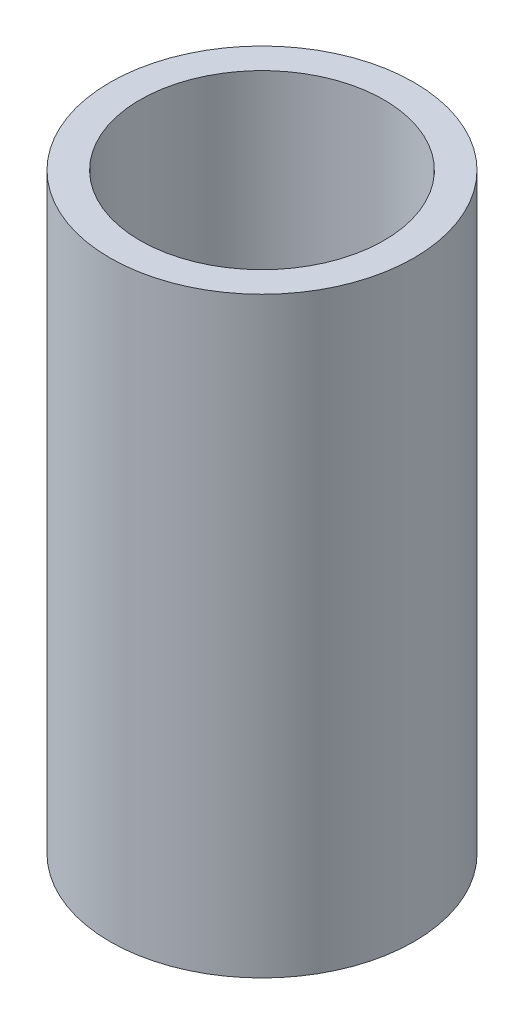
ISO-10303-21;
HEADER;
FILE_DESCRIPTION(('STEP AP214'),'2;1');
FILE_NAME('part.step','',(''),(''),'','','');
FILE_SCHEMA(('AUTOMOTIVE_DESIGN { 1 0 10303 214 1 1 1 1 }'));
ENDSEC;
DATA;
#1=APPLICATION_CONTEXT('core data for automotive mechanical design processes');
#2=APPLICATION_PROTOCOL_DEFINITION('international standard','automotive_design',2000,#1);
#3=PRODUCT_CONTEXT('',#1,'mechanical');
#4=PRODUCT('Part','Part','',(#3));
#5=PRODUCT_RELATED_PRODUCT_CATEGORY('part','',(#4));
#6=PRODUCT_DEFINITION_FORMATION('','',#4);
#7=PRODUCT_DEFINITION_CONTEXT('part definition',#1,'design');
#8=PRODUCT_DEFINITION('design','',#6,#7);
#9=PRODUCT_DEFINITION_SHAPE('','',#8);
#10=(LENGTH_UNIT() NAMED_UNIT(*) SI_UNIT(.MILLI.,.METRE.));
#11=(NAMED_UNIT(*) PLANE_ANGLE_UNIT() SI_UNIT($,.RADIAN.));
#12=(NAMED_UNIT(*) SI_UNIT($,.STERADIAN.) SOLID_ANGLE_UNIT());
#13=UNCERTAINTY_MEASURE_WITH_UNIT(LENGTH_MEASURE(1.E-05),#10,'distance_accuracy_value','');
#14=(GEOMETRIC_REPRESENTATION_CONTEXT(3) GLOBAL_UNCERTAINTY_ASSIGNED_CONTEXT((#13)) GLOBAL_UNIT_ASSIGNED_CONTEXT((#10,
#11,#12)) REPRESENTATION_CONTEXT('',''));
#15=CARTESIAN_POINT('',(0.,0.,0.));
#16=DIRECTION('',(0.,0.,1.));
#17=DIRECTION('',(1.,0.,0.));
#18=AXIS2_PLACEMENT_3D('',#15,#16,#17);
#19=CARTESIAN_POINT('',(0.,29.5,0.));
#20=DIRECTION('',(0.,1.,0.));
#21=DIRECTION('',(0.,0.,1.));
#22=AXIS2_PLACEMENT_3D('',#19,#20,#21);
#23=PLANE('',#22);
#24=CARTESIAN_POINT('',(0.,29.5,0.));
#25=DIRECTION('',(0.,1.,0.));
#26=DIRECTION('',(0.,0.,1.));
#27=AXIS2_PLACEMENT_3D('',#24,#25,#26);
#28=CIRCLE('',#27,7.575);
#29=CARTESIAN_POINT('',(0.,29.5,7.575));
#30=VERTEX_POINT('',#29);
#31=EDGE_CURVE('E10',#30,#30,#28,.T.);
#32=ORIENTED_EDGE('',*,*,#31,.T.);
#33=EDGE_LOOP('',(#32));
#34=FACE_BOUND('',#33,.T.);
#35=CARTESIAN_POINT('',(0.,29.5,0.));
#36=DIRECTION('',(0.,1.,0.));
#37=DIRECTION('',(0.,0.,1.));
#38=AXIS2_PLACEMENT_3D('',#35,#36,#37);
#39=CIRCLE('',#38,6.075);
#40=CARTESIAN_POINT('',(0.,29.5,6.075));
#41=VERTEX_POINT('',#40);
#42=EDGE_CURVE('E42',#41,#41,#39,.T.);
#43=ORIENTED_EDGE('',*,*,#42,.F.);
#44=EDGE_LOOP('',(#43));
#45=FACE_BOUND('',#44,.T.);
#46=ADVANCED_FACE('F31',(#34,#45),#23,.T.);
#47=CARTESIAN_POINT('',(0.,0.,0.));
#48=DIRECTION('',(0.,1.,0.));
#49=DIRECTION('',(0.,0.,1.));
#50=AXIS2_PLACEMENT_3D('',#47,#48,#49);
#51=PLANE('',#50);
#52=CARTESIAN_POINT('',(0.,0.,0.));
#53=DIRECTION('',(0.,1.,0.));
#54=DIRECTION('',(0.,0.,1.));
#55=AXIS2_PLACEMENT_3D('',#52,#53,#54);
#56=CIRCLE('',#55,7.575);
#57=CARTESIAN_POINT('',(0.,0.,7.575));
#58=VERTEX_POINT('',#57);
#59=EDGE_CURVE('E35',#58,#58,#56,.T.);
#60=ORIENTED_EDGE('',*,*,#59,.F.);
#61=EDGE_LOOP('',(#60));
#62=FACE_BOUND('',#61,.T.);
#63=CARTESIAN_POINT('',(0.,0.,0.));
#64=DIRECTION('',(0.,1.,0.));
#65=DIRECTION('',(0.,0.,1.));
#66=AXIS2_PLACEMENT_3D('',#63,#64,#65);
#67=CIRCLE('',#66,6.075);
#68=CARTESIAN_POINT('',(0.,0.,6.075));
#69=VERTEX_POINT('',#68);
#70=EDGE_CURVE('E44',#69,#69,#67,.T.);
#71=ORIENTED_EDGE('',*,*,#70,.T.);
#72=EDGE_LOOP('',(#71));
#73=FACE_BOUND('',#72,.T.);
#74=ADVANCED_FACE('F54',(#62,#73),#51,.F.);
#75=CARTESIAN_POINT('',(0.,29.5,0.));
#76=DIRECTION('',(0.,-1.,0.));
#77=DIRECTION('',(0.,0.,-1.));
#78=AXIS2_PLACEMENT_3D('',#75,#76,#77);
#79=CYLINDRICAL_SURFACE('',#78,7.575);
#80=ORIENTED_EDGE('',*,*,#31,.F.);
#81=EDGE_LOOP('',(#80));
#82=FACE_BOUND('',#81,.T.);
#83=ORIENTED_EDGE('',*,*,#59,.T.);
#84=EDGE_LOOP('',(#83));
#85=FACE_BOUND('',#84,.T.);
#86=ADVANCED_FACE('F33',(#82,#85),#79,.T.);
#87=CARTESIAN_POINT('',(0.,29.5,0.));
#88=DIRECTION('',(0.,-1.,0.));
#89=DIRECTION('',(0.,0.,-1.));
#90=AXIS2_PLACEMENT_3D('',#87,#88,#89);
#91=CYLINDRICAL_SURFACE('',#90,6.075);
#92=ORIENTED_EDGE('',*,*,#42,.T.);
#93=EDGE_LOOP('',(#92));
#94=FACE_BOUND('',#93,.T.);
#95=ORIENTED_EDGE('',*,*,#70,.F.);
#96=EDGE_LOOP('',(#95));
#97=FACE_BOUND('',#96,.T.);
#98=ADVANCED_FACE('F50',(#94,#97),#91,.F.);
#99=CLOSED_SHELL('',(#46,#74,#86,#98));
#100=MANIFOLD_SOLID_BREP('B2',#99);
#101=ADVANCED_BREP_SHAPE_REPRESENTATION('',(#18,#100),#14);
#102=SHAPE_DEFINITION_REPRESENTATION(#9,#101);
ENDSEC;
END-ISO-10303-21;
